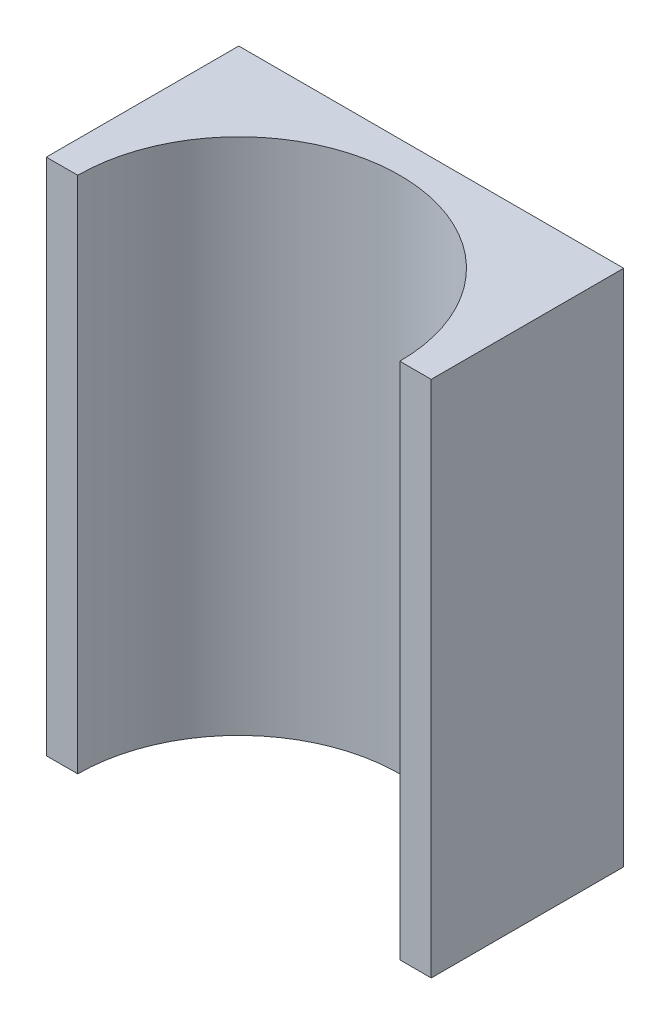
ISO-10303-21;
HEADER;
FILE_DESCRIPTION(('STEP AP214'),'2;1');
FILE_NAME('part.step','',(''),(''),'','','');
FILE_SCHEMA(('AUTOMOTIVE_DESIGN { 1 0 10303 214 1 1 1 1 }'));
ENDSEC;
DATA;
#1=APPLICATION_CONTEXT('core data for automotive mechanical design processes');
#2=APPLICATION_PROTOCOL_DEFINITION('international standard','automotive_design',2000,#1);
#3=PRODUCT_CONTEXT('',#1,'mechanical');
#4=PRODUCT('Part','Part','',(#3));
#5=PRODUCT_RELATED_PRODUCT_CATEGORY('part','',(#4));
#6=PRODUCT_DEFINITION_FORMATION('','',#4);
#7=PRODUCT_DEFINITION_CONTEXT('part definition',#1,'design');
#8=PRODUCT_DEFINITION('design','',#6,#7);
#9=PRODUCT_DEFINITION_SHAPE('','',#8);
#10=(LENGTH_UNIT() NAMED_UNIT(*) SI_UNIT(.MILLI.,.METRE.));
#11=(NAMED_UNIT(*) PLANE_ANGLE_UNIT() SI_UNIT($,.RADIAN.));
#12=(NAMED_UNIT(*) SI_UNIT($,.STERADIAN.) SOLID_ANGLE_UNIT());
#13=UNCERTAINTY_MEASURE_WITH_UNIT(LENGTH_MEASURE(1.E-05),#10,'distance_accuracy_value','');
#14=(GEOMETRIC_REPRESENTATION_CONTEXT(3) GLOBAL_UNCERTAINTY_ASSIGNED_CONTEXT((#13)) GLOBAL_UNIT_ASSIGNED_CONTEXT((#10,
#11,#12)) REPRESENTATION_CONTEXT('',''));
#15=CARTESIAN_POINT('',(0.,0.,0.));
#16=DIRECTION('',(0.,0.,1.));
#17=DIRECTION('',(1.,0.,0.));
#18=AXIS2_PLACEMENT_3D('',#15,#16,#17);
#19=CARTESIAN_POINT('',(49.,132.,-24.5));
#20=DIRECTION('',(-1.,0.,0.));
#21=DIRECTION('',(0.,0.,1.));
#22=AXIS2_PLACEMENT_3D('',#19,#20,#21);
#23=PLANE('',#22);
#24=DIRECTION('',(0.,0.,-1.));
#25=VECTOR('',#24,1.);
#26=CARTESIAN_POINT('',(49.,0.,-24.5));
#27=LINE('',#26,#25);
#28=CARTESIAN_POINT('',(49.,0.,24.5));
#29=VERTEX_POINT('',#28);
#30=CARTESIAN_POINT('',(49.,0.,-24.5));
#31=VERTEX_POINT('',#30);
#32=EDGE_CURVE('E130',#29,#31,#27,.T.);
#33=ORIENTED_EDGE('',*,*,#32,.T.);
#34=DIRECTION('',(0.,-1.,0.));
#35=VECTOR('',#34,1.);
#36=CARTESIAN_POINT('',(49.,132.,-24.5));
#37=LINE('',#36,#35);
#38=CARTESIAN_POINT('',(49.,132.,-24.5));
#39=VERTEX_POINT('',#38);
#40=EDGE_CURVE('E11',#39,#31,#37,.T.);
#41=ORIENTED_EDGE('',*,*,#40,.F.);
#42=DIRECTION('',(0.,0.,-1.));
#43=VECTOR('',#42,1.);
#44=CARTESIAN_POINT('',(49.,132.,-24.5));
#45=LINE('',#44,#43);
#46=CARTESIAN_POINT('',(49.,132.,24.5));
#47=VERTEX_POINT('',#46);
#48=EDGE_CURVE('E146',#47,#39,#45,.T.);
#49=ORIENTED_EDGE('',*,*,#48,.F.);
#50=DIRECTION('',(0.,-1.,0.));
#51=VECTOR('',#50,1.);
#52=CARTESIAN_POINT('',(49.,132.,24.5));
#53=LINE('',#52,#51);
#54=EDGE_CURVE('E126',#47,#29,#53,.T.);
#55=ORIENTED_EDGE('',*,*,#54,.T.);
#56=EDGE_LOOP('',(#33,#41,#49,#55));
#57=FACE_BOUND('',#56,.T.);
#58=ADVANCED_FACE('F41',(#57),#23,.F.);
#59=CARTESIAN_POINT('',(-49.,132.,-24.5));
#60=DIRECTION('',(0.,0.,1.));
#61=DIRECTION('',(1.,0.,0.));
#62=AXIS2_PLACEMENT_3D('',#59,#60,#61);
#63=PLANE('',#62);
#64=DIRECTION('',(-1.,0.,0.));
#65=VECTOR('',#64,1.);
#66=CARTESIAN_POINT('',(-49.,0.,-24.5));
#67=LINE('',#66,#65);
#68=CARTESIAN_POINT('',(-49.,0.,-24.5));
#69=VERTEX_POINT('',#68);
#70=EDGE_CURVE('E134',#31,#69,#67,.T.);
#71=ORIENTED_EDGE('',*,*,#70,.T.);
#72=DIRECTION('',(0.,-1.,0.));
#73=VECTOR('',#72,1.);
#74=CARTESIAN_POINT('',(-49.,132.,-24.5));
#75=LINE('',#74,#73);
#76=CARTESIAN_POINT('',(-49.,132.,-24.5));
#77=VERTEX_POINT('',#76);
#78=EDGE_CURVE('E50',#77,#69,#75,.T.);
#79=ORIENTED_EDGE('',*,*,#78,.F.);
#80=DIRECTION('',(-1.,0.,0.));
#81=VECTOR('',#80,1.);
#82=CARTESIAN_POINT('',(-49.,132.,-24.5));
#83=LINE('',#82,#81);
#84=EDGE_CURVE('E95',#39,#77,#83,.T.);
#85=ORIENTED_EDGE('',*,*,#84,.F.);
#86=ORIENTED_EDGE('',*,*,#40,.T.);
#87=EDGE_LOOP('',(#71,#79,#85,#86));
#88=FACE_BOUND('',#87,.T.);
#89=ADVANCED_FACE('F174',(#88),#63,.F.);
#90=CARTESIAN_POINT('',(-49.,132.,-24.5));
#91=DIRECTION('',(1.,0.,0.));
#92=DIRECTION('',(0.,0.,-1.));
#93=AXIS2_PLACEMENT_3D('',#90,#91,#92);
#94=PLANE('',#93);
#95=DIRECTION('',(0.,0.,1.));
#96=VECTOR('',#95,1.);
#97=CARTESIAN_POINT('',(-49.,0.,-24.5));
#98=LINE('',#97,#96);
#99=CARTESIAN_POINT('',(-49.,0.,24.5));
#100=VERTEX_POINT('',#99);
#101=EDGE_CURVE('E137',#69,#100,#98,.T.);
#102=ORIENTED_EDGE('',*,*,#101,.T.);
#103=DIRECTION('',(0.,-1.,0.));
#104=VECTOR('',#103,1.);
#105=CARTESIAN_POINT('',(-49.,132.,24.5));
#106=LINE('',#105,#104);
#107=CARTESIAN_POINT('',(-49.,132.,24.5));
#108=VERTEX_POINT('',#107);
#109=EDGE_CURVE('E119',#108,#100,#106,.T.);
#110=ORIENTED_EDGE('',*,*,#109,.F.);
#111=DIRECTION('',(0.,0.,1.));
#112=VECTOR('',#111,1.);
#113=CARTESIAN_POINT('',(-49.,132.,-24.5));
#114=LINE('',#113,#112);
#115=EDGE_CURVE('E108',#77,#108,#114,.T.);
#116=ORIENTED_EDGE('',*,*,#115,.F.);
#117=ORIENTED_EDGE('',*,*,#78,.T.);
#118=EDGE_LOOP('',(#102,#110,#116,#117));
#119=FACE_BOUND('',#118,.T.);
#120=ADVANCED_FACE('F156',(#119),#94,.F.);
#121=CARTESIAN_POINT('',(-49.,132.,24.5));
#122=DIRECTION('',(0.,0.,-1.));
#123=DIRECTION('',(-1.,0.,0.));
#124=AXIS2_PLACEMENT_3D('',#121,#122,#123);
#125=PLANE('',#124);
#126=DIRECTION('',(1.,0.,0.));
#127=VECTOR('',#126,1.);
#128=CARTESIAN_POINT('',(-49.,0.,24.5));
#129=LINE('',#128,#127);
#130=CARTESIAN_POINT('',(-41.,0.,24.5));
#131=VERTEX_POINT('',#130);
#132=EDGE_CURVE('E117',#100,#131,#129,.T.);
#133=ORIENTED_EDGE('',*,*,#132,.T.);
#134=DIRECTION('',(0.,-1.,0.));
#135=VECTOR('',#134,1.);
#136=CARTESIAN_POINT('',(-41.,132.,24.5));
#137=LINE('',#136,#135);
#138=CARTESIAN_POINT('',(-41.,132.,24.5));
#139=VERTEX_POINT('',#138);
#140=EDGE_CURVE('E114',#139,#131,#137,.T.);
#141=ORIENTED_EDGE('',*,*,#140,.F.);
#142=DIRECTION('',(1.,0.,0.));
#143=VECTOR('',#142,1.);
#144=CARTESIAN_POINT('',(-49.,132.,24.5));
#145=LINE('',#144,#143);
#146=EDGE_CURVE('E102',#108,#139,#145,.T.);
#147=ORIENTED_EDGE('',*,*,#146,.F.);
#148=ORIENTED_EDGE('',*,*,#109,.T.);
#149=EDGE_LOOP('',(#133,#141,#147,#148));
#150=FACE_BOUND('',#149,.T.);
#151=ADVANCED_FACE('F115',(#150),#125,.F.);
#152=CARTESIAN_POINT('',(0.,132.,24.5));
#153=DIRECTION('',(0.,-1.,0.));
#154=DIRECTION('',(0.,0.,-1.));
#155=AXIS2_PLACEMENT_3D('',#152,#153,#154);
#156=CYLINDRICAL_SURFACE('',#155,41.);
#157=CARTESIAN_POINT('',(0.,0.,24.5));
#158=DIRECTION('',(0.,-1.,0.));
#159=DIRECTION('',(0.,0.,1.));
#160=AXIS2_PLACEMENT_3D('',#157,#158,#159);
#161=CIRCLE('',#160,41.);
#162=CARTESIAN_POINT('',(41.,0.,24.5));
#163=VERTEX_POINT('',#162);
#164=EDGE_CURVE('E81',#131,#163,#161,.T.);
#165=ORIENTED_EDGE('',*,*,#164,.T.);
#166=DIRECTION('',(0.,-1.,0.));
#167=VECTOR('',#166,1.);
#168=CARTESIAN_POINT('',(41.,132.,24.5));
#169=LINE('',#168,#167);
#170=CARTESIAN_POINT('',(41.,132.,24.5));
#171=VERTEX_POINT('',#170);
#172=EDGE_CURVE('E120',#171,#163,#169,.T.);
#173=ORIENTED_EDGE('',*,*,#172,.F.);
#174=CARTESIAN_POINT('',(0.,132.,24.5));
#175=DIRECTION('',(0.,-1.,0.));
#176=DIRECTION('',(0.,0.,1.));
#177=AXIS2_PLACEMENT_3D('',#174,#175,#176);
#178=CIRCLE('',#177,41.);
#179=EDGE_CURVE('E106',#139,#171,#178,.T.);
#180=ORIENTED_EDGE('',*,*,#179,.F.);
#181=ORIENTED_EDGE('',*,*,#140,.T.);
#182=EDGE_LOOP('',(#165,#173,#180,#181));
#183=FACE_BOUND('',#182,.T.);
#184=ADVANCED_FACE('F122',(#183),#156,.F.);
#185=CARTESIAN_POINT('',(41.,132.,24.5));
#186=DIRECTION('',(0.,0.,-1.));
#187=DIRECTION('',(-1.,0.,0.));
#188=AXIS2_PLACEMENT_3D('',#185,#186,#187);
#189=PLANE('',#188);
#190=DIRECTION('',(1.,0.,0.));
#191=VECTOR('',#190,1.);
#192=CARTESIAN_POINT('',(41.,0.,24.5));
#193=LINE('',#192,#191);
#194=EDGE_CURVE('E87',#163,#29,#193,.T.);
#195=ORIENTED_EDGE('',*,*,#194,.T.);
#196=ORIENTED_EDGE('',*,*,#54,.F.);
#197=DIRECTION('',(1.,0.,0.));
#198=VECTOR('',#197,1.);
#199=CARTESIAN_POINT('',(41.,132.,24.5));
#200=LINE('',#199,#198);
#201=EDGE_CURVE('E58',#171,#47,#200,.T.);
#202=ORIENTED_EDGE('',*,*,#201,.F.);
#203=ORIENTED_EDGE('',*,*,#172,.T.);
#204=EDGE_LOOP('',(#195,#196,#202,#203));
#205=FACE_BOUND('',#204,.T.);
#206=ADVANCED_FACE('F163',(#205),#189,.F.);
#207=CARTESIAN_POINT('',(0.,132.,24.5));
#208=DIRECTION('',(0.,1.,0.));
#209=DIRECTION('',(0.,0.,1.));
#210=AXIS2_PLACEMENT_3D('',#207,#208,#209);
#211=PLANE('',#210);
#212=ORIENTED_EDGE('',*,*,#48,.T.);
#213=ORIENTED_EDGE('',*,*,#84,.T.);
#214=ORIENTED_EDGE('',*,*,#115,.T.);
#215=ORIENTED_EDGE('',*,*,#146,.T.);
#216=ORIENTED_EDGE('',*,*,#179,.T.);
#217=ORIENTED_EDGE('',*,*,#201,.T.);
#218=EDGE_LOOP('',(#212,#213,#214,#215,#216,#217));
#219=FACE_BOUND('',#218,.T.);
#220=ADVANCED_FACE('F104',(#219),#211,.T.);
#221=CARTESIAN_POINT('',(0.,0.,24.5));
#222=DIRECTION('',(0.,1.,0.));
#223=DIRECTION('',(0.,0.,1.));
#224=AXIS2_PLACEMENT_3D('',#221,#222,#223);
#225=PLANE('',#224);
#226=ORIENTED_EDGE('',*,*,#32,.F.);
#227=ORIENTED_EDGE('',*,*,#194,.F.);
#228=ORIENTED_EDGE('',*,*,#164,.F.);
#229=ORIENTED_EDGE('',*,*,#132,.F.);
#230=ORIENTED_EDGE('',*,*,#101,.F.);
#231=ORIENTED_EDGE('',*,*,#70,.F.);
#232=EDGE_LOOP('',(#226,#227,#228,#229,#230,#231));
#233=FACE_BOUND('',#232,.T.);
#234=ADVANCED_FACE('F159',(#233),#225,.F.);
#235=CLOSED_SHELL('',(#58,#89,#120,#151,#184,#206,#220,#234));
#236=MANIFOLD_SOLID_BREP('B2',#235);
#237=ADVANCED_BREP_SHAPE_REPRESENTATION('',(#18,#236),#14);
#238=SHAPE_DEFINITION_REPRESENTATION(#9,#237);
ENDSEC;
END-ISO-10303-21;
